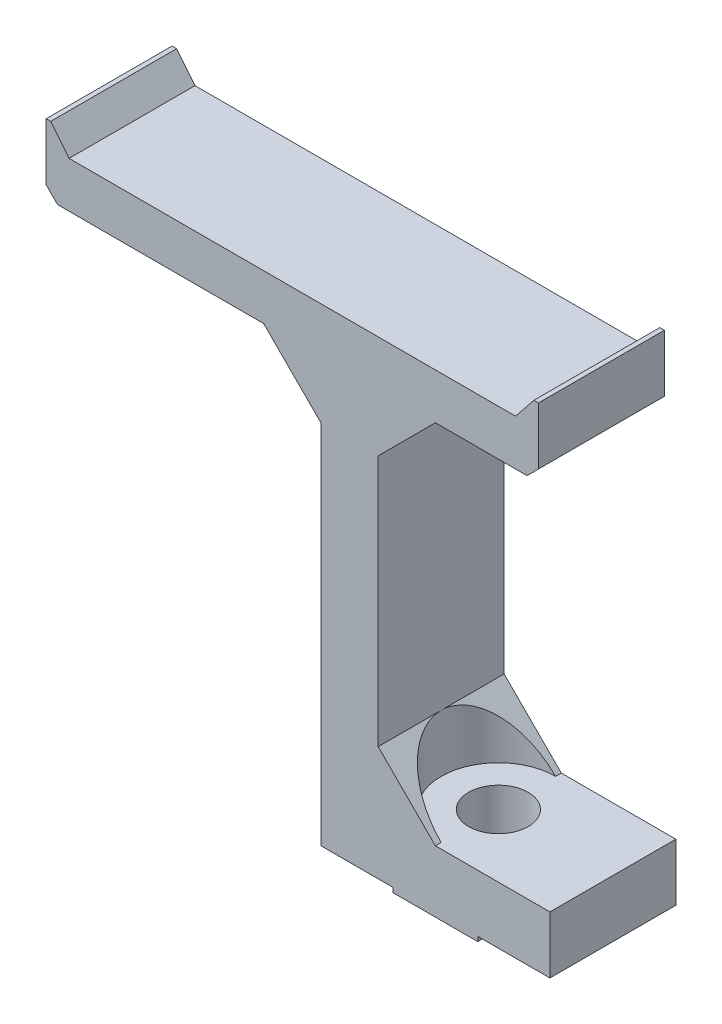
ISO-10303-21;
HEADER;
FILE_DESCRIPTION(('STEP AP214'),'2;1');
FILE_NAME('part.step','',(''),(''),'','','');
FILE_SCHEMA(('AUTOMOTIVE_DESIGN { 1 0 10303 214 1 1 1 1 }'));
ENDSEC;
DATA;
#1=APPLICATION_CONTEXT('core data for automotive mechanical design processes');
#2=APPLICATION_PROTOCOL_DEFINITION('international standard','automotive_design',2000,#1);
#3=PRODUCT_CONTEXT('',#1,'mechanical');
#4=PRODUCT('Part','Part','',(#3));
#5=PRODUCT_RELATED_PRODUCT_CATEGORY('part','',(#4));
#6=PRODUCT_DEFINITION_FORMATION('','',#4);
#7=PRODUCT_DEFINITION_CONTEXT('part definition',#1,'design');
#8=PRODUCT_DEFINITION('design','',#6,#7);
#9=PRODUCT_DEFINITION_SHAPE('','',#8);
#10=(LENGTH_UNIT() NAMED_UNIT(*) SI_UNIT(.MILLI.,.METRE.));
#11=(NAMED_UNIT(*) PLANE_ANGLE_UNIT() SI_UNIT($,.RADIAN.));
#12=(NAMED_UNIT(*) SI_UNIT($,.STERADIAN.) SOLID_ANGLE_UNIT());
#13=UNCERTAINTY_MEASURE_WITH_UNIT(LENGTH_MEASURE(1.E-05),#10,'distance_accuracy_value','');
#14=(GEOMETRIC_REPRESENTATION_CONTEXT(3) GLOBAL_UNCERTAINTY_ASSIGNED_CONTEXT((#13)) GLOBAL_UNIT_ASSIGNED_CONTEXT((#10,
#11,#12)) REPRESENTATION_CONTEXT('',''));
#15=CARTESIAN_POINT('',(0.,0.,0.));
#16=DIRECTION('',(0.,0.,1.));
#17=DIRECTION('',(1.,0.,0.));
#18=AXIS2_PLACEMENT_3D('',#15,#16,#17);
#19=CARTESIAN_POINT('',(-5.,10.4000000000087,11.));
#20=DIRECTION('',(0.707106781186548,0.707106781186547,0.));
#21=DIRECTION('',(0.,0.,1.));
#22=AXIS2_PLACEMENT_3D('',#19,#20,#21);
#23=PLANE('',#22);
#24=CARTESIAN_POINT('',(0.,5.40000000000869,5.5));
#25=DIRECTION('',(0.707106781186548,0.707106781186547,0.));
#26=DIRECTION('',(0.707106781186547,-0.707106781186548,0.));
#27=AXIS2_PLACEMENT_3D('',#24,#25,#26);
#28=ELLIPSE('',#27,7.07106781186548,5.);
#29=CARTESIAN_POINT('',(0.,5.40000000000873,0.499999999999997));
#30=VERTEX_POINT('',#29);
#31=CARTESIAN_POINT('',(-5.,10.4000000000087,5.5));
#32=VERTEX_POINT('',#31);
#33=EDGE_CURVE('E11',#30,#32,#28,.T.);
#34=ORIENTED_EDGE('',*,*,#33,.F.);
#35=DIRECTION('',(0.,0.,1.));
#36=VECTOR('',#35,1.);
#37=CARTESIAN_POINT('',(0.,5.40000000000873,11.));
#38=LINE('',#37,#36);
#39=CARTESIAN_POINT('',(0.,5.40000000000873,0.));
#40=VERTEX_POINT('',#39);
#41=EDGE_CURVE('E217',#40,#30,#38,.T.);
#42=ORIENTED_EDGE('',*,*,#41,.F.);
#43=DIRECTION('',(-0.707106781186547,0.707106781186548,0.));
#44=VECTOR('',#43,1.);
#45=CARTESIAN_POINT('',(2.70000000000435,2.70000000000434,0.));
#46=LINE('',#45,#44);
#47=CARTESIAN_POINT('',(-5.,10.4000000000087,0.));
#48=VERTEX_POINT('',#47);
#49=EDGE_CURVE('E238',#48,#40,#46,.F.);
#50=ORIENTED_EDGE('',*,*,#49,.F.);
#51=DIRECTION('',(0.,0.,-1.));
#52=VECTOR('',#51,1.);
#53=CARTESIAN_POINT('',(-5.,10.4000000000087,0.));
#54=LINE('',#53,#52);
#55=EDGE_CURVE('E339',#32,#48,#54,.T.);
#56=ORIENTED_EDGE('',*,*,#55,.F.);
#57=EDGE_LOOP('',(#34,#42,#50,#56));
#58=FACE_BOUND('',#57,.T.);
#59=ADVANCED_FACE('F36',(#58),#23,.T.);
#60=CARTESIAN_POINT('',(0.,5.40000000000873,10.5));
#61=VERTEX_POINT('',#60);
#62=EDGE_CURVE('E40',#32,#61,#28,.T.);
#63=ORIENTED_EDGE('',*,*,#62,.F.);
#64=CARTESIAN_POINT('',(-5.,10.4000000000087,11.));
#65=VERTEX_POINT('',#64);
#66=EDGE_CURVE('E226',#65,#32,#54,.T.);
#67=ORIENTED_EDGE('',*,*,#66,.F.);
#68=DIRECTION('',(0.707106781186547,-0.707106781186548,0.));
#69=VECTOR('',#68,1.);
#70=CARTESIAN_POINT('',(-5.,10.4000000000087,11.));
#71=LINE('',#70,#69);
#72=CARTESIAN_POINT('',(0.,5.40000000000873,11.));
#73=VERTEX_POINT('',#72);
#74=EDGE_CURVE('E222',#73,#65,#71,.F.);
#75=ORIENTED_EDGE('',*,*,#74,.F.);
#76=EDGE_CURVE('E213',#61,#73,#38,.T.);
#77=ORIENTED_EDGE('',*,*,#76,.F.);
#78=EDGE_LOOP('',(#63,#67,#75,#77));
#79=FACE_BOUND('',#78,.T.);
#80=ADVANCED_FACE('F221',(#79),#23,.T.);
#81=CARTESIAN_POINT('',(-10.,0.4,11.));
#82=DIRECTION('',(1.,0.,0.));
#83=DIRECTION('',(0.,1.,0.));
#84=AXIS2_PLACEMENT_3D('',#81,#82,#83);
#85=PLANE('',#84);
#86=DIRECTION('',(0.,-1.,0.));
#87=VECTOR('',#86,1.);
#88=CARTESIAN_POINT('',(-10.,0.4,11.));
#89=LINE('',#88,#87);
#90=CARTESIAN_POINT('',(-10.,32.4,11.));
#91=VERTEX_POINT('',#90);
#92=CARTESIAN_POINT('',(-10.,0.4,11.));
#93=VERTEX_POINT('',#92);
#94=EDGE_CURVE('E291',#91,#93,#89,.T.);
#95=ORIENTED_EDGE('',*,*,#94,.F.);
#96=DIRECTION('',(0.,0.,-1.));
#97=VECTOR('',#96,1.);
#98=CARTESIAN_POINT('',(-10.,32.4,0.));
#99=LINE('',#98,#97);
#100=CARTESIAN_POINT('',(-10.,32.4,0.));
#101=VERTEX_POINT('',#100);
#102=EDGE_CURVE('E331',#91,#101,#99,.T.);
#103=ORIENTED_EDGE('',*,*,#102,.T.);
#104=DIRECTION('',(0.,-1.,0.));
#105=VECTOR('',#104,1.);
#106=CARTESIAN_POINT('',(-10.,0.4,0.));
#107=LINE('',#106,#105);
#108=CARTESIAN_POINT('',(-10.,0.4,0.));
#109=VERTEX_POINT('',#108);
#110=EDGE_CURVE('E365',#101,#109,#107,.T.);
#111=ORIENTED_EDGE('',*,*,#110,.T.);
#112=DIRECTION('',(0.,0.,-1.));
#113=VECTOR('',#112,1.);
#114=CARTESIAN_POINT('',(-10.,0.4,11.));
#115=LINE('',#114,#113);
#116=EDGE_CURVE('E328',#93,#109,#115,.T.);
#117=ORIENTED_EDGE('',*,*,#116,.F.);
#118=EDGE_LOOP('',(#95,#103,#111,#117));
#119=FACE_BOUND('',#118,.T.);
#120=ADVANCED_FACE('F433',(#119),#85,.F.);
#121=CARTESIAN_POINT('',(-10.,0.4,11.));
#122=DIRECTION('',(0.,1.,0.));
#123=DIRECTION('',(0.,0.,1.));
#124=AXIS2_PLACEMENT_3D('',#121,#122,#123);
#125=PLANE('',#124);
#126=DIRECTION('',(1.,0.,0.));
#127=VECTOR('',#126,1.);
#128=CARTESIAN_POINT('',(-10.,0.4,0.));
#129=LINE('',#128,#127);
#130=CARTESIAN_POINT('',(-3.7,0.4,0.));
#131=VERTEX_POINT('',#130);
#132=EDGE_CURVE('E363',#109,#131,#129,.T.);
#133=ORIENTED_EDGE('',*,*,#132,.T.);
#134=DIRECTION('',(0.,0.,-1.));
#135=VECTOR('',#134,1.);
#136=CARTESIAN_POINT('',(-3.7,0.4,11.));
#137=LINE('',#136,#135);
#138=CARTESIAN_POINT('',(-3.7,0.4,11.));
#139=VERTEX_POINT('',#138);
#140=EDGE_CURVE('E325',#139,#131,#137,.T.);
#141=ORIENTED_EDGE('',*,*,#140,.F.);
#142=DIRECTION('',(1.,0.,0.));
#143=VECTOR('',#142,1.);
#144=CARTESIAN_POINT('',(-10.,0.4,11.));
#145=LINE('',#144,#143);
#146=EDGE_CURVE('E400',#93,#139,#145,.T.);
#147=ORIENTED_EDGE('',*,*,#146,.F.);
#148=ORIENTED_EDGE('',*,*,#116,.T.);
#149=EDGE_LOOP('',(#133,#141,#147,#148));
#150=FACE_BOUND('',#149,.T.);
#151=ADVANCED_FACE('F465',(#150),#125,.F.);
#152=CARTESIAN_POINT('',(-3.7,0.4,11.));
#153=DIRECTION('',(1.,0.,0.));
#154=DIRECTION('',(0.,1.,0.));
#155=AXIS2_PLACEMENT_3D('',#152,#153,#154);
#156=PLANE('',#155);
#157=DIRECTION('',(0.,-1.,0.));
#158=VECTOR('',#157,1.);
#159=CARTESIAN_POINT('',(-3.7,0.4,0.));
#160=LINE('',#159,#158);
#161=CARTESIAN_POINT('',(-3.7,0.,0.));
#162=VERTEX_POINT('',#161);
#163=EDGE_CURVE('E361',#131,#162,#160,.T.);
#164=ORIENTED_EDGE('',*,*,#163,.T.);
#165=DIRECTION('',(0.,0.,-1.));
#166=VECTOR('',#165,1.);
#167=CARTESIAN_POINT('',(-3.7,0.,11.));
#168=LINE('',#167,#166);
#169=CARTESIAN_POINT('',(-3.7,0.,11.));
#170=VERTEX_POINT('',#169);
#171=EDGE_CURVE('E322',#170,#162,#168,.T.);
#172=ORIENTED_EDGE('',*,*,#171,.F.);
#173=DIRECTION('',(0.,-1.,0.));
#174=VECTOR('',#173,1.);
#175=CARTESIAN_POINT('',(-3.7,0.4,11.));
#176=LINE('',#175,#174);
#177=EDGE_CURVE('E398',#139,#170,#176,.T.);
#178=ORIENTED_EDGE('',*,*,#177,.F.);
#179=ORIENTED_EDGE('',*,*,#140,.T.);
#180=EDGE_LOOP('',(#164,#172,#178,#179));
#181=FACE_BOUND('',#180,.T.);
#182=ADVANCED_FACE('F472',(#181),#156,.F.);
#183=CARTESIAN_POINT('',(-3.7,0.,11.));
#184=DIRECTION('',(0.,1.,0.));
#185=DIRECTION('',(0.,0.,1.));
#186=AXIS2_PLACEMENT_3D('',#183,#184,#185);
#187=PLANE('',#186);
#188=CARTESIAN_POINT('',(0.,0.,5.5));
#189=DIRECTION('',(0.,1.,0.));
#190=DIRECTION('',(-1.,0.,0.));
#191=AXIS2_PLACEMENT_3D('',#188,#189,#190);
#192=CIRCLE('',#191,2.6);
#193=CARTESIAN_POINT('',(-2.6,0.,5.5));
#194=VERTEX_POINT('',#193);
#195=EDGE_CURVE('E367',#194,#194,#192,.T.);
#196=ORIENTED_EDGE('',*,*,#195,.T.);
#197=EDGE_LOOP('',(#196));
#198=FACE_BOUND('',#197,.T.);
#199=DIRECTION('',(1.,0.,0.));
#200=VECTOR('',#199,1.);
#201=CARTESIAN_POINT('',(-3.7,0.,0.));
#202=LINE('',#201,#200);
#203=CARTESIAN_POINT('',(3.7,0.,0.));
#204=VERTEX_POINT('',#203);
#205=EDGE_CURVE('E359',#162,#204,#202,.T.);
#206=ORIENTED_EDGE('',*,*,#205,.T.);
#207=DIRECTION('',(0.,0.,-1.));
#208=VECTOR('',#207,1.);
#209=CARTESIAN_POINT('',(3.7,0.,11.));
#210=LINE('',#209,#208);
#211=CARTESIAN_POINT('',(3.7,0.,11.));
#212=VERTEX_POINT('',#211);
#213=EDGE_CURVE('E319',#212,#204,#210,.T.);
#214=ORIENTED_EDGE('',*,*,#213,.F.);
#215=DIRECTION('',(1.,0.,0.));
#216=VECTOR('',#215,1.);
#217=CARTESIAN_POINT('',(-3.7,0.,11.));
#218=LINE('',#217,#216);
#219=EDGE_CURVE('E396',#170,#212,#218,.T.);
#220=ORIENTED_EDGE('',*,*,#219,.F.);
#221=ORIENTED_EDGE('',*,*,#171,.T.);
#222=EDGE_LOOP('',(#206,#214,#220,#221));
#223=FACE_BOUND('',#222,.T.);
#224=ADVANCED_FACE('F408',(#198,#223),#187,.F.);
#225=CARTESIAN_POINT('',(3.7,0.,11.));
#226=DIRECTION('',(-1.,0.,0.));
#227=DIRECTION('',(0.,0.,1.));
#228=AXIS2_PLACEMENT_3D('',#225,#226,#227);
#229=PLANE('',#228);
#230=DIRECTION('',(0.,1.,0.));
#231=VECTOR('',#230,1.);
#232=CARTESIAN_POINT('',(3.7,0.,0.));
#233=LINE('',#232,#231);
#234=CARTESIAN_POINT('',(3.7,0.4,0.));
#235=VERTEX_POINT('',#234);
#236=EDGE_CURVE('E357',#204,#235,#233,.T.);
#237=ORIENTED_EDGE('',*,*,#236,.T.);
#238=DIRECTION('',(0.,0.,-1.));
#239=VECTOR('',#238,1.);
#240=CARTESIAN_POINT('',(3.7,0.4,11.));
#241=LINE('',#240,#239);
#242=CARTESIAN_POINT('',(3.7,0.4,11.));
#243=VERTEX_POINT('',#242);
#244=EDGE_CURVE('E316',#243,#235,#241,.T.);
#245=ORIENTED_EDGE('',*,*,#244,.F.);
#246=DIRECTION('',(0.,1.,0.));
#247=VECTOR('',#246,1.);
#248=CARTESIAN_POINT('',(3.7,0.,11.));
#249=LINE('',#248,#247);
#250=EDGE_CURVE('E394',#212,#243,#249,.T.);
#251=ORIENTED_EDGE('',*,*,#250,.F.);
#252=ORIENTED_EDGE('',*,*,#213,.T.);
#253=EDGE_LOOP('',(#237,#245,#251,#252));
#254=FACE_BOUND('',#253,.T.);
#255=ADVANCED_FACE('F479',(#254),#229,.F.);
#256=CARTESIAN_POINT('',(3.7,0.4,11.));
#257=DIRECTION('',(0.,1.,0.));
#258=DIRECTION('',(-1.,0.,0.));
#259=AXIS2_PLACEMENT_3D('',#256,#257,#258);
#260=PLANE('',#259);
#261=DIRECTION('',(1.,0.,0.));
#262=VECTOR('',#261,1.);
#263=CARTESIAN_POINT('',(3.7,0.4,0.));
#264=LINE('',#263,#262);
#265=CARTESIAN_POINT('',(10.,0.400000000000017,0.));
#266=VERTEX_POINT('',#265);
#267=EDGE_CURVE('E355',#235,#266,#264,.T.);
#268=ORIENTED_EDGE('',*,*,#267,.T.);
#269=DIRECTION('',(0.,0.,-1.));
#270=VECTOR('',#269,1.);
#271=CARTESIAN_POINT('',(10.,0.400000000000017,11.));
#272=LINE('',#271,#270);
#273=CARTESIAN_POINT('',(10.,0.400000000000017,11.));
#274=VERTEX_POINT('',#273);
#275=EDGE_CURVE('E313',#274,#266,#272,.T.);
#276=ORIENTED_EDGE('',*,*,#275,.F.);
#277=DIRECTION('',(1.,0.,0.));
#278=VECTOR('',#277,1.);
#279=CARTESIAN_POINT('',(3.7,0.4,11.));
#280=LINE('',#279,#278);
#281=EDGE_CURVE('E392',#243,#274,#280,.T.);
#282=ORIENTED_EDGE('',*,*,#281,.F.);
#283=ORIENTED_EDGE('',*,*,#244,.T.);
#284=EDGE_LOOP('',(#268,#276,#282,#283));
#285=FACE_BOUND('',#284,.T.);
#286=ADVANCED_FACE('F425',(#285),#260,.F.);
#287=CARTESIAN_POINT('',(10.,0.400000000000017,11.));
#288=DIRECTION('',(-1.,0.,0.));
#289=DIRECTION('',(0.,-1.,0.));
#290=AXIS2_PLACEMENT_3D('',#287,#288,#289);
#291=PLANE('',#290);
#292=DIRECTION('',(0.,1.,0.));
#293=VECTOR('',#292,1.);
#294=CARTESIAN_POINT('',(10.,0.400000000000017,0.));
#295=LINE('',#294,#293);
#296=CARTESIAN_POINT('',(10.,5.40000000000873,0.));
#297=VERTEX_POINT('',#296);
#298=EDGE_CURVE('E351',#266,#297,#295,.T.);
#299=ORIENTED_EDGE('',*,*,#298,.T.);
#300=DIRECTION('',(0.,0.,-1.));
#301=VECTOR('',#300,1.);
#302=CARTESIAN_POINT('',(10.,5.40000000000873,11.));
#303=LINE('',#302,#301);
#304=CARTESIAN_POINT('',(10.,5.40000000000873,11.));
#305=VERTEX_POINT('',#304);
#306=EDGE_CURVE('E310',#305,#297,#303,.T.);
#307=ORIENTED_EDGE('',*,*,#306,.F.);
#308=DIRECTION('',(0.,1.,0.));
#309=VECTOR('',#308,1.);
#310=CARTESIAN_POINT('',(10.,0.400000000000017,11.));
#311=LINE('',#310,#309);
#312=EDGE_CURVE('E390',#274,#305,#311,.T.);
#313=ORIENTED_EDGE('',*,*,#312,.F.);
#314=ORIENTED_EDGE('',*,*,#275,.T.);
#315=EDGE_LOOP('',(#299,#307,#313,#314));
#316=FACE_BOUND('',#315,.T.);
#317=ADVANCED_FACE('F417',(#316),#291,.F.);
#318=CARTESIAN_POINT('',(10.,5.40000000000873,11.));
#319=DIRECTION('',(0.,-1.,0.));
#320=DIRECTION('',(1.,0.,0.));
#321=AXIS2_PLACEMENT_3D('',#318,#319,#320);
#322=PLANE('',#321);
#323=ORIENTED_EDGE('',*,*,#41,.T.);
#324=CARTESIAN_POINT('',(0.,5.40000000000873,5.5));
#325=DIRECTION('',(0.,1.,0.));
#326=DIRECTION('',(-1.,0.,0.));
#327=AXIS2_PLACEMENT_3D('',#324,#325,#326);
#328=CIRCLE('',#327,5.);
#329=EDGE_CURVE('E202',#30,#61,#328,.T.);
#330=ORIENTED_EDGE('',*,*,#329,.T.);
#331=ORIENTED_EDGE('',*,*,#76,.T.);
#332=DIRECTION('',(-1.,0.,0.));
#333=VECTOR('',#332,1.);
#334=CARTESIAN_POINT('',(10.,5.40000000000873,11.));
#335=LINE('',#334,#333);
#336=EDGE_CURVE('E388',#305,#73,#335,.T.);
#337=ORIENTED_EDGE('',*,*,#336,.F.);
#338=ORIENTED_EDGE('',*,*,#306,.T.);
#339=DIRECTION('',(-1.,0.,0.));
#340=VECTOR('',#339,1.);
#341=CARTESIAN_POINT('',(10.,5.40000000000873,0.));
#342=LINE('',#341,#340);
#343=EDGE_CURVE('E350',#297,#40,#342,.T.);
#344=ORIENTED_EDGE('',*,*,#343,.T.);
#345=EDGE_LOOP('',(#323,#330,#331,#337,#338,#344));
#346=FACE_BOUND('',#345,.T.);
#347=CARTESIAN_POINT('',(0.,5.40000000000873,5.5));
#348=DIRECTION('',(0.,1.,0.));
#349=DIRECTION('',(-1.,0.,0.));
#350=AXIS2_PLACEMENT_3D('',#347,#348,#349);
#351=CIRCLE('',#350,2.6);
#352=CARTESIAN_POINT('',(-2.6,5.40000000000873,5.5));
#353=VERTEX_POINT('',#352);
#354=EDGE_CURVE('E218',#353,#353,#351,.T.);
#355=ORIENTED_EDGE('',*,*,#354,.F.);
#356=EDGE_LOOP('',(#355));
#357=FACE_BOUND('',#356,.T.);
#358=ADVANCED_FACE('F210',(#346,#357),#322,.F.);
#359=CARTESIAN_POINT('',(-5.00000000000001,5.40000000000873,11.));
#360=DIRECTION('',(-1.,0.,0.));
#361=DIRECTION('',(0.,-1.,0.));
#362=AXIS2_PLACEMENT_3D('',#359,#360,#361);
#363=PLANE('',#362);
#364=DIRECTION('',(0.,1.,0.));
#365=VECTOR('',#364,1.);
#366=CARTESIAN_POINT('',(-5.00000000000001,5.40000000000873,0.));
#367=LINE('',#366,#365);
#368=CARTESIAN_POINT('',(-5.,32.4,0.));
#369=VERTEX_POINT('',#368);
#370=EDGE_CURVE('E275',#48,#369,#367,.T.);
#371=ORIENTED_EDGE('',*,*,#370,.T.);
#372=DIRECTION('',(0.,0.,1.));
#373=VECTOR('',#372,1.);
#374=CARTESIAN_POINT('',(-5.,32.4,11.));
#375=LINE('',#374,#373);
#376=CARTESIAN_POINT('',(-5.,32.4,11.));
#377=VERTEX_POINT('',#376);
#378=EDGE_CURVE('E223',#369,#377,#375,.T.);
#379=ORIENTED_EDGE('',*,*,#378,.T.);
#380=DIRECTION('',(0.,1.,0.));
#381=VECTOR('',#380,1.);
#382=CARTESIAN_POINT('',(-5.00000000000001,5.40000000000873,11.));
#383=LINE('',#382,#381);
#384=EDGE_CURVE('E385',#65,#377,#383,.T.);
#385=ORIENTED_EDGE('',*,*,#384,.F.);
#386=ORIENTED_EDGE('',*,*,#66,.T.);
#387=ORIENTED_EDGE('',*,*,#55,.T.);
#388=EDGE_LOOP('',(#371,#379,#385,#386,#387));
#389=FACE_BOUND('',#388,.T.);
#390=ADVANCED_FACE('F345',(#389),#363,.F.);
#391=CARTESIAN_POINT('',(8.99999999999998,37.4,11.));
#392=DIRECTION('',(0.,1.,0.));
#393=DIRECTION('',(-1.,0.,0.));
#394=AXIS2_PLACEMENT_3D('',#391,#392,#393);
#395=PLANE('',#394);
#396=DIRECTION('',(1.,0.,0.));
#397=VECTOR('',#396,1.);
#398=CARTESIAN_POINT('',(8.99999999999998,37.4,0.));
#399=LINE('',#398,#397);
#400=CARTESIAN_POINT('',(0.,37.4,0.));
#401=VERTEX_POINT('',#400);
#402=CARTESIAN_POINT('',(7.99999999999998,37.4,0.));
#403=VERTEX_POINT('',#402);
#404=EDGE_CURVE('E271',#401,#403,#399,.T.);
#405=ORIENTED_EDGE('',*,*,#404,.T.);
#406=DIRECTION('',(0.,0.,1.));
#407=VECTOR('',#406,1.);
#408=CARTESIAN_POINT('',(7.99999999999998,37.4,11.));
#409=LINE('',#408,#407);
#410=CARTESIAN_POINT('',(7.99999999999998,37.4,11.));
#411=VERTEX_POINT('',#410);
#412=EDGE_CURVE('E59',#403,#411,#409,.T.);
#413=ORIENTED_EDGE('',*,*,#412,.T.);
#414=DIRECTION('',(1.,0.,0.));
#415=VECTOR('',#414,1.);
#416=CARTESIAN_POINT('',(8.99999999999998,37.4,11.));
#417=LINE('',#416,#415);
#418=CARTESIAN_POINT('',(0.,37.4,11.));
#419=VERTEX_POINT('',#418);
#420=EDGE_CURVE('E383',#419,#411,#417,.T.);
#421=ORIENTED_EDGE('',*,*,#420,.F.);
#422=DIRECTION('',(0.,0.,-1.));
#423=VECTOR('',#422,1.);
#424=CARTESIAN_POINT('',(0.,37.4,0.));
#425=LINE('',#424,#423);
#426=EDGE_CURVE('E337',#419,#401,#425,.T.);
#427=ORIENTED_EDGE('',*,*,#426,.T.);
#428=EDGE_LOOP('',(#405,#413,#421,#427));
#429=FACE_BOUND('',#428,.T.);
#430=ADVANCED_FACE('F423',(#429),#395,.F.);
#431=CARTESIAN_POINT('',(8.99999999999998,37.4,11.));
#432=DIRECTION('',(-1.,0.,0.));
#433=DIRECTION('',(0.,-1.,0.));
#434=AXIS2_PLACEMENT_3D('',#431,#432,#433);
#435=PLANE('',#434);
#436=DIRECTION('',(0.,1.,0.));
#437=VECTOR('',#436,1.);
#438=CARTESIAN_POINT('',(8.99999999999998,37.4,11.));
#439=LINE('',#438,#437);
#440=CARTESIAN_POINT('',(8.99999999999998,38.4,11.));
#441=VERTEX_POINT('',#440);
#442=CARTESIAN_POINT('',(8.99999999999999,43.4,11.));
#443=VERTEX_POINT('',#442);
#444=EDGE_CURVE('E262',#441,#443,#439,.T.);
#445=ORIENTED_EDGE('',*,*,#444,.F.);
#446=DIRECTION('',(0.,0.,-1.));
#447=VECTOR('',#446,1.);
#448=CARTESIAN_POINT('',(8.99999999999998,38.4,11.));
#449=LINE('',#448,#447);
#450=CARTESIAN_POINT('',(8.99999999999998,38.4,0.));
#451=VERTEX_POINT('',#450);
#452=EDGE_CURVE('E253',#441,#451,#449,.T.);
#453=ORIENTED_EDGE('',*,*,#452,.T.);
#454=DIRECTION('',(0.,1.,0.));
#455=VECTOR('',#454,1.);
#456=CARTESIAN_POINT('',(8.99999999999998,37.4,0.));
#457=LINE('',#456,#455);
#458=CARTESIAN_POINT('',(8.99999999999999,43.4,0.));
#459=VERTEX_POINT('',#458);
#460=EDGE_CURVE('E260',#451,#459,#457,.T.);
#461=ORIENTED_EDGE('',*,*,#460,.T.);
#462=DIRECTION('',(0.,0.,-1.));
#463=VECTOR('',#462,1.);
#464=CARTESIAN_POINT('',(8.99999999999999,43.4,11.));
#465=LINE('',#464,#463);
#466=EDGE_CURVE('E308',#443,#459,#465,.T.);
#467=ORIENTED_EDGE('',*,*,#466,.F.);
#468=EDGE_LOOP('',(#445,#453,#461,#467));
#469=FACE_BOUND('',#468,.T.);
#470=ADVANCED_FACE('F258',(#469),#435,.F.);
#471=CARTESIAN_POINT('',(8.99999999999999,43.4,11.));
#472=DIRECTION('',(0.,-1.,0.));
#473=DIRECTION('',(1.,0.,0.));
#474=AXIS2_PLACEMENT_3D('',#471,#472,#473);
#475=PLANE('',#474);
#476=DIRECTION('',(-1.,0.,0.));
#477=VECTOR('',#476,1.);
#478=CARTESIAN_POINT('',(8.99999999999999,43.4,0.));
#479=LINE('',#478,#477);
#480=CARTESIAN_POINT('',(8.59999999999999,43.4,0.));
#481=VERTEX_POINT('',#480);
#482=EDGE_CURVE('E270',#459,#481,#479,.T.);
#483=ORIENTED_EDGE('',*,*,#482,.T.);
#484=DIRECTION('',(0.,0.,-1.));
#485=VECTOR('',#484,1.);
#486=CARTESIAN_POINT('',(8.59999999999999,43.4,11.));
#487=LINE('',#486,#485);
#488=CARTESIAN_POINT('',(8.59999999999999,43.4,11.));
#489=VERTEX_POINT('',#488);
#490=EDGE_CURVE('E305',#489,#481,#487,.T.);
#491=ORIENTED_EDGE('',*,*,#490,.F.);
#492=DIRECTION('',(-1.,0.,0.));
#493=VECTOR('',#492,1.);
#494=CARTESIAN_POINT('',(8.99999999999999,43.4,11.));
#495=LINE('',#494,#493);
#496=EDGE_CURVE('E380',#443,#489,#495,.T.);
#497=ORIENTED_EDGE('',*,*,#496,.F.);
#498=ORIENTED_EDGE('',*,*,#466,.T.);
#499=EDGE_LOOP('',(#483,#491,#497,#498));
#500=FACE_BOUND('',#499,.T.);
#501=ADVANCED_FACE('F494',(#500),#475,.F.);
#502=CARTESIAN_POINT('',(8.59999999999999,43.4,11.));
#503=DIRECTION('',(0.780868809443031,-0.624695047554424,0.));
#504=DIRECTION('',(0.624695047554424,0.78086880944303,0.));
#505=AXIS2_PLACEMENT_3D('',#502,#503,#504);
#506=PLANE('',#505);
#507=DIRECTION('',(-0.624695047554424,-0.78086880944303,0.));
#508=VECTOR('',#507,1.);
#509=CARTESIAN_POINT('',(8.59999999999999,43.4,0.));
#510=LINE('',#509,#508);
#511=CARTESIAN_POINT('',(6.99999999999999,41.4,0.));
#512=VERTEX_POINT('',#511);
#513=EDGE_CURVE('E273',#481,#512,#510,.T.);
#514=ORIENTED_EDGE('',*,*,#513,.T.);
#515=DIRECTION('',(0.,0.,-1.));
#516=VECTOR('',#515,1.);
#517=CARTESIAN_POINT('',(6.99999999999999,41.4,11.));
#518=LINE('',#517,#516);
#519=CARTESIAN_POINT('',(6.99999999999999,41.4,11.));
#520=VERTEX_POINT('',#519);
#521=EDGE_CURVE('E302',#520,#512,#518,.T.);
#522=ORIENTED_EDGE('',*,*,#521,.F.);
#523=DIRECTION('',(-0.624695047554424,-0.78086880944303,0.));
#524=VECTOR('',#523,1.);
#525=CARTESIAN_POINT('',(8.59999999999999,43.4,11.));
#526=LINE('',#525,#524);
#527=EDGE_CURVE('E378',#489,#520,#526,.T.);
#528=ORIENTED_EDGE('',*,*,#527,.F.);
#529=ORIENTED_EDGE('',*,*,#490,.T.);
#530=EDGE_LOOP('',(#514,#522,#528,#529));
#531=FACE_BOUND('',#530,.T.);
#532=ADVANCED_FACE('F499',(#531),#506,.F.);
#533=CARTESIAN_POINT('',(6.99999999999999,41.4,11.));
#534=DIRECTION('',(0.,-1.,0.));
#535=DIRECTION('',(0.,0.,-1.));
#536=AXIS2_PLACEMENT_3D('',#533,#534,#535);
#537=PLANE('',#536);
#538=DIRECTION('',(-1.,0.,0.));
#539=VECTOR('',#538,1.);
#540=CARTESIAN_POINT('',(6.99999999999999,41.4,0.));
#541=LINE('',#540,#539);
#542=CARTESIAN_POINT('',(-32.,41.4,0.));
#543=VERTEX_POINT('',#542);
#544=EDGE_CURVE('E280',#512,#543,#541,.T.);
#545=ORIENTED_EDGE('',*,*,#544,.T.);
#546=DIRECTION('',(0.,0.,-1.));
#547=VECTOR('',#546,1.);
#548=CARTESIAN_POINT('',(-32.,41.4,11.));
#549=LINE('',#548,#547);
#550=CARTESIAN_POINT('',(-32.,41.4,11.));
#551=VERTEX_POINT('',#550);
#552=EDGE_CURVE('E299',#551,#543,#549,.T.);
#553=ORIENTED_EDGE('',*,*,#552,.F.);
#554=DIRECTION('',(-1.,0.,0.));
#555=VECTOR('',#554,1.);
#556=CARTESIAN_POINT('',(6.99999999999999,41.4,11.));
#557=LINE('',#556,#555);
#558=EDGE_CURVE('E376',#520,#551,#557,.T.);
#559=ORIENTED_EDGE('',*,*,#558,.F.);
#560=ORIENTED_EDGE('',*,*,#521,.T.);
#561=EDGE_LOOP('',(#545,#553,#559,#560));
#562=FACE_BOUND('',#561,.T.);
#563=ADVANCED_FACE('F503',(#562),#537,.F.);
#564=CARTESIAN_POINT('',(-33.6,43.4,11.));
#565=DIRECTION('',(-0.780868809443034,-0.62469504755442,0.));
#566=DIRECTION('',(0.62469504755442,-0.780868809443034,0.));
#567=AXIS2_PLACEMENT_3D('',#564,#565,#566);
#568=PLANE('',#567);
#569=DIRECTION('',(-0.62469504755442,0.780868809443034,0.));
#570=VECTOR('',#569,1.);
#571=CARTESIAN_POINT('',(-33.6,43.4,0.));
#572=LINE('',#571,#570);
#573=CARTESIAN_POINT('',(-33.6,43.4,0.));
#574=VERTEX_POINT('',#573);
#575=EDGE_CURVE('E282',#543,#574,#572,.T.);
#576=ORIENTED_EDGE('',*,*,#575,.T.);
#577=DIRECTION('',(0.,0.,-1.));
#578=VECTOR('',#577,1.);
#579=CARTESIAN_POINT('',(-33.6,43.4,11.));
#580=LINE('',#579,#578);
#581=CARTESIAN_POINT('',(-33.6,43.4,11.));
#582=VERTEX_POINT('',#581);
#583=EDGE_CURVE('E295',#582,#574,#580,.T.);
#584=ORIENTED_EDGE('',*,*,#583,.F.);
#585=DIRECTION('',(-0.62469504755442,0.780868809443034,0.));
#586=VECTOR('',#585,1.);
#587=CARTESIAN_POINT('',(-33.6,43.4,11.));
#588=LINE('',#587,#586);
#589=EDGE_CURVE('E374',#551,#582,#588,.T.);
#590=ORIENTED_EDGE('',*,*,#589,.F.);
#591=ORIENTED_EDGE('',*,*,#552,.T.);
#592=EDGE_LOOP('',(#576,#584,#590,#591));
#593=FACE_BOUND('',#592,.T.);
#594=ADVANCED_FACE('F507',(#593),#568,.F.);
#595=CARTESIAN_POINT('',(-34.,43.4,11.));
#596=DIRECTION('',(0.,-1.,0.));
#597=DIRECTION('',(0.,0.,-1.));
#598=AXIS2_PLACEMENT_3D('',#595,#596,#597);
#599=PLANE('',#598);
#600=DIRECTION('',(-1.,0.,0.));
#601=VECTOR('',#600,1.);
#602=CARTESIAN_POINT('',(-34.,43.4,0.));
#603=LINE('',#602,#601);
#604=CARTESIAN_POINT('',(-34.,43.4,0.));
#605=VERTEX_POINT('',#604);
#606=EDGE_CURVE('E284',#574,#605,#603,.T.);
#607=ORIENTED_EDGE('',*,*,#606,.T.);
#608=DIRECTION('',(0.,0.,-1.));
#609=VECTOR('',#608,1.);
#610=CARTESIAN_POINT('',(-34.,43.4,11.));
#611=LINE('',#610,#609);
#612=CARTESIAN_POINT('',(-34.,43.4,11.));
#613=VERTEX_POINT('',#612);
#614=EDGE_CURVE('E292',#613,#605,#611,.T.);
#615=ORIENTED_EDGE('',*,*,#614,.F.);
#616=DIRECTION('',(-1.,0.,0.));
#617=VECTOR('',#616,1.);
#618=CARTESIAN_POINT('',(-34.,43.4,11.));
#619=LINE('',#618,#617);
#620=EDGE_CURVE('E372',#582,#613,#619,.T.);
#621=ORIENTED_EDGE('',*,*,#620,.F.);
#622=ORIENTED_EDGE('',*,*,#583,.T.);
#623=EDGE_LOOP('',(#607,#615,#621,#622));
#624=FACE_BOUND('',#623,.T.);
#625=ADVANCED_FACE('F511',(#624),#599,.F.);
#626=CARTESIAN_POINT('',(-34.,37.4,11.));
#627=DIRECTION('',(1.,0.,0.));
#628=DIRECTION('',(0.,1.,0.));
#629=AXIS2_PLACEMENT_3D('',#626,#627,#628);
#630=PLANE('',#629);
#631=DIRECTION('',(0.,-1.,0.));
#632=VECTOR('',#631,1.);
#633=CARTESIAN_POINT('',(-34.,37.4,0.));
#634=LINE('',#633,#632);
#635=CARTESIAN_POINT('',(-34.,38.4,0.));
#636=VERTEX_POINT('',#635);
#637=EDGE_CURVE('E286',#605,#636,#634,.T.);
#638=ORIENTED_EDGE('',*,*,#637,.T.);
#639=DIRECTION('',(0.,0.,1.));
#640=VECTOR('',#639,1.);
#641=CARTESIAN_POINT('',(-34.,38.4,11.));
#642=LINE('',#641,#640);
#643=CARTESIAN_POINT('',(-34.,38.4,11.));
#644=VERTEX_POINT('',#643);
#645=EDGE_CURVE('E248',#636,#644,#642,.T.);
#646=ORIENTED_EDGE('',*,*,#645,.T.);
#647=DIRECTION('',(0.,-1.,0.));
#648=VECTOR('',#647,1.);
#649=CARTESIAN_POINT('',(-34.,37.4,11.));
#650=LINE('',#649,#648);
#651=EDGE_CURVE('E369',#613,#644,#650,.T.);
#652=ORIENTED_EDGE('',*,*,#651,.F.);
#653=ORIENTED_EDGE('',*,*,#614,.T.);
#654=EDGE_LOOP('',(#638,#646,#652,#653));
#655=FACE_BOUND('',#654,.T.);
#656=ADVANCED_FACE('F515',(#655),#630,.F.);
#657=CARTESIAN_POINT('',(-10.,37.4,11.));
#658=DIRECTION('',(0.,1.,0.));
#659=DIRECTION('',(-1.,0.,0.));
#660=AXIS2_PLACEMENT_3D('',#657,#658,#659);
#661=PLANE('',#660);
#662=DIRECTION('',(1.,0.,0.));
#663=VECTOR('',#662,1.);
#664=CARTESIAN_POINT('',(-10.,37.4,11.));
#665=LINE('',#664,#663);
#666=CARTESIAN_POINT('',(-33.,37.4,11.));
#667=VERTEX_POINT('',#666);
#668=CARTESIAN_POINT('',(-15.,37.4,11.));
#669=VERTEX_POINT('',#668);
#670=EDGE_CURVE('E296',#667,#669,#665,.T.);
#671=ORIENTED_EDGE('',*,*,#670,.F.);
#672=DIRECTION('',(0.,0.,-1.));
#673=VECTOR('',#672,1.);
#674=CARTESIAN_POINT('',(-33.,37.4,11.));
#675=LINE('',#674,#673);
#676=CARTESIAN_POINT('',(-33.,37.4,0.));
#677=VERTEX_POINT('',#676);
#678=EDGE_CURVE('E241',#667,#677,#675,.T.);
#679=ORIENTED_EDGE('',*,*,#678,.T.);
#680=DIRECTION('',(1.,0.,0.));
#681=VECTOR('',#680,1.);
#682=CARTESIAN_POINT('',(-10.,37.4,0.));
#683=LINE('',#682,#681);
#684=CARTESIAN_POINT('',(-15.,37.4,0.));
#685=VERTEX_POINT('',#684);
#686=EDGE_CURVE('E289',#677,#685,#683,.T.);
#687=ORIENTED_EDGE('',*,*,#686,.T.);
#688=DIRECTION('',(0.,0.,1.));
#689=VECTOR('',#688,1.);
#690=CARTESIAN_POINT('',(-15.,37.4,11.));
#691=LINE('',#690,#689);
#692=EDGE_CURVE('E334',#685,#669,#691,.T.);
#693=ORIENTED_EDGE('',*,*,#692,.T.);
#694=EDGE_LOOP('',(#671,#679,#687,#693));
#695=FACE_BOUND('',#694,.T.);
#696=ADVANCED_FACE('F453',(#695),#661,.F.);
#697=CARTESIAN_POINT('',(0.,0.,11.));
#698=DIRECTION('',(0.,0.,1.));
#699=DIRECTION('',(1.,0.,0.));
#700=AXIS2_PLACEMENT_3D('',#697,#698,#699);
#701=PLANE('',#700);
#702=ORIENTED_EDGE('',*,*,#651,.T.);
#703=DIRECTION('',(-0.707106781186545,0.70710678118655,0.));
#704=VECTOR('',#703,1.);
#705=CARTESIAN_POINT('',(2.19999999999988,2.19999999999987,11.));
#706=LINE('',#705,#704);
#707=EDGE_CURVE('E251',#644,#667,#706,.F.);
#708=ORIENTED_EDGE('',*,*,#707,.T.);
#709=ORIENTED_EDGE('',*,*,#670,.T.);
#710=DIRECTION('',(-0.707106781186548,0.707106781186548,0.));
#711=VECTOR('',#710,1.);
#712=CARTESIAN_POINT('',(-10.,32.4,11.));
#713=LINE('',#712,#711);
#714=EDGE_CURVE('E232',#669,#91,#713,.F.);
#715=ORIENTED_EDGE('',*,*,#714,.T.);
#716=ORIENTED_EDGE('',*,*,#94,.T.);
#717=ORIENTED_EDGE('',*,*,#146,.T.);
#718=ORIENTED_EDGE('',*,*,#177,.T.);
#719=ORIENTED_EDGE('',*,*,#219,.T.);
#720=ORIENTED_EDGE('',*,*,#250,.T.);
#721=ORIENTED_EDGE('',*,*,#281,.T.);
#722=ORIENTED_EDGE('',*,*,#312,.T.);
#723=ORIENTED_EDGE('',*,*,#336,.T.);
#724=ORIENTED_EDGE('',*,*,#74,.T.);
#725=ORIENTED_EDGE('',*,*,#384,.T.);
#726=DIRECTION('',(-0.707106781186548,-0.707106781186547,0.));
#727=VECTOR('',#726,1.);
#728=CARTESIAN_POINT('',(0.,37.4,11.));
#729=LINE('',#728,#727);
#730=EDGE_CURVE('E236',#377,#419,#729,.F.);
#731=ORIENTED_EDGE('',*,*,#730,.T.);
#732=ORIENTED_EDGE('',*,*,#420,.T.);
#733=DIRECTION('',(-0.70710678118655,-0.707106781186545,0.));
#734=VECTOR('',#733,1.);
#735=CARTESIAN_POINT('',(-14.7,14.7000000000001,11.));
#736=LINE('',#735,#734);
#737=EDGE_CURVE('E51',#411,#441,#736,.F.);
#738=ORIENTED_EDGE('',*,*,#737,.T.);
#739=ORIENTED_EDGE('',*,*,#444,.T.);
#740=ORIENTED_EDGE('',*,*,#496,.T.);
#741=ORIENTED_EDGE('',*,*,#527,.T.);
#742=ORIENTED_EDGE('',*,*,#558,.T.);
#743=ORIENTED_EDGE('',*,*,#589,.T.);
#744=ORIENTED_EDGE('',*,*,#620,.T.);
#745=EDGE_LOOP('',(#702,#708,#709,#715,#716,#717,#718,#719,#720,#721,#722,#723,#724,#725,#731,
#732,#738,#739,#740,#741,#742,#743,#744));
#746=FACE_BOUND('',#745,.T.);
#747=ADVANCED_FACE('F450',(#746),#701,.T.);
#748=CARTESIAN_POINT('',(0.,0.,0.));
#749=DIRECTION('',(0.,0.,1.));
#750=DIRECTION('',(1.,0.,0.));
#751=AXIS2_PLACEMENT_3D('',#748,#749,#750);
#752=PLANE('',#751);
#753=ORIENTED_EDGE('',*,*,#686,.F.);
#754=DIRECTION('',(0.707106781186545,-0.70710678118655,0.));
#755=VECTOR('',#754,1.);
#756=CARTESIAN_POINT('',(-33.,37.4,0.));
#757=LINE('',#756,#755);
#758=EDGE_CURVE('E246',#677,#636,#757,.F.);
#759=ORIENTED_EDGE('',*,*,#758,.T.);
#760=ORIENTED_EDGE('',*,*,#637,.F.);
#761=ORIENTED_EDGE('',*,*,#606,.F.);
#762=ORIENTED_EDGE('',*,*,#575,.F.);
#763=ORIENTED_EDGE('',*,*,#544,.F.);
#764=ORIENTED_EDGE('',*,*,#513,.F.);
#765=ORIENTED_EDGE('',*,*,#482,.F.);
#766=ORIENTED_EDGE('',*,*,#460,.F.);
#767=DIRECTION('',(0.70710678118655,0.707106781186545,0.));
#768=VECTOR('',#767,1.);
#769=CARTESIAN_POINT('',(8.99999999999998,38.4,0.));
#770=LINE('',#769,#768);
#771=EDGE_CURVE('E244',#451,#403,#770,.F.);
#772=ORIENTED_EDGE('',*,*,#771,.T.);
#773=ORIENTED_EDGE('',*,*,#404,.F.);
#774=DIRECTION('',(0.707106781186548,0.707106781186547,0.));
#775=VECTOR('',#774,1.);
#776=CARTESIAN_POINT('',(-18.7,18.7,0.));
#777=LINE('',#776,#775);
#778=EDGE_CURVE('E234',#401,#369,#777,.F.);
#779=ORIENTED_EDGE('',*,*,#778,.T.);
#780=ORIENTED_EDGE('',*,*,#370,.F.);
#781=ORIENTED_EDGE('',*,*,#49,.T.);
#782=ORIENTED_EDGE('',*,*,#343,.F.);
#783=ORIENTED_EDGE('',*,*,#298,.F.);
#784=ORIENTED_EDGE('',*,*,#267,.F.);
#785=ORIENTED_EDGE('',*,*,#236,.F.);
#786=ORIENTED_EDGE('',*,*,#205,.F.);
#787=ORIENTED_EDGE('',*,*,#163,.F.);
#788=ORIENTED_EDGE('',*,*,#132,.F.);
#789=ORIENTED_EDGE('',*,*,#110,.F.);
#790=DIRECTION('',(0.707106781186548,-0.707106781186548,0.));
#791=VECTOR('',#790,1.);
#792=CARTESIAN_POINT('',(11.2,11.2,0.));
#793=LINE('',#792,#791);
#794=EDGE_CURVE('E225',#101,#685,#793,.F.);
#795=ORIENTED_EDGE('',*,*,#794,.T.);
#796=EDGE_LOOP('',(#753,#759,#760,#761,#762,#763,#764,#765,#766,#772,#773,#779,#780,#781,#782,
#783,#784,#785,#786,#787,#788,#789,#795));
#797=FACE_BOUND('',#796,.T.);
#798=ADVANCED_FACE('F267',(#797),#752,.F.);
#799=CARTESIAN_POINT('',(-10.,32.4,11.));
#800=DIRECTION('',(-0.707106781186548,-0.707106781186548,0.));
#801=DIRECTION('',(0.,0.,1.));
#802=AXIS2_PLACEMENT_3D('',#799,#800,#801);
#803=PLANE('',#802);
#804=ORIENTED_EDGE('',*,*,#714,.F.);
#805=ORIENTED_EDGE('',*,*,#692,.F.);
#806=ORIENTED_EDGE('',*,*,#794,.F.);
#807=ORIENTED_EDGE('',*,*,#102,.F.);
#808=EDGE_LOOP('',(#804,#805,#806,#807));
#809=FACE_BOUND('',#808,.T.);
#810=ADVANCED_FACE('F444',(#809),#803,.T.);
#811=CARTESIAN_POINT('',(0.,37.4,11.));
#812=DIRECTION('',(0.707106781186547,-0.707106781186548,0.));
#813=DIRECTION('',(0.,0.,1.));
#814=AXIS2_PLACEMENT_3D('',#811,#812,#813);
#815=PLANE('',#814);
#816=ORIENTED_EDGE('',*,*,#730,.F.);
#817=ORIENTED_EDGE('',*,*,#378,.F.);
#818=ORIENTED_EDGE('',*,*,#778,.F.);
#819=ORIENTED_EDGE('',*,*,#426,.F.);
#820=EDGE_LOOP('',(#816,#817,#818,#819));
#821=FACE_BOUND('',#820,.T.);
#822=ADVANCED_FACE('F435',(#821),#815,.T.);
#823=CARTESIAN_POINT('',(-33.,37.4,11.));
#824=DIRECTION('',(0.70710678118655,0.707106781186545,0.));
#825=DIRECTION('',(0.,0.,-1.));
#826=AXIS2_PLACEMENT_3D('',#823,#824,#825);
#827=PLANE('',#826);
#828=ORIENTED_EDGE('',*,*,#707,.F.);
#829=ORIENTED_EDGE('',*,*,#645,.F.);
#830=ORIENTED_EDGE('',*,*,#758,.F.);
#831=ORIENTED_EDGE('',*,*,#678,.F.);
#832=EDGE_LOOP('',(#828,#829,#830,#831));
#833=FACE_BOUND('',#832,.T.);
#834=ADVANCED_FACE('F437',(#833),#827,.F.);
#835=CARTESIAN_POINT('',(8.99999999999998,38.4,11.));
#836=DIRECTION('',(-0.707106781186545,0.70710678118655,0.));
#837=DIRECTION('',(0.,0.,-1.));
#838=AXIS2_PLACEMENT_3D('',#835,#836,#837);
#839=PLANE('',#838);
#840=ORIENTED_EDGE('',*,*,#737,.F.);
#841=ORIENTED_EDGE('',*,*,#412,.F.);
#842=ORIENTED_EDGE('',*,*,#771,.F.);
#843=ORIENTED_EDGE('',*,*,#452,.F.);
#844=EDGE_LOOP('',(#840,#841,#842,#843));
#845=FACE_BOUND('',#844,.T.);
#846=ADVANCED_FACE('F38',(#845),#839,.F.);
#847=CARTESIAN_POINT('',(0.,0.,5.5));
#848=DIRECTION('',(0.,1.,0.));
#849=DIRECTION('',(-1.,0.,0.));
#850=AXIS2_PLACEMENT_3D('',#847,#848,#849);
#851=CYLINDRICAL_SURFACE('',#850,2.6);
#852=ORIENTED_EDGE('',*,*,#195,.F.);
#853=EDGE_LOOP('',(#852));
#854=FACE_BOUND('',#853,.T.);
#855=ORIENTED_EDGE('',*,*,#354,.T.);
#856=EDGE_LOOP('',(#855));
#857=FACE_BOUND('',#856,.T.);
#858=ADVANCED_FACE('F411',(#854,#857),#851,.F.);
#859=CARTESIAN_POINT('',(0.,10.4000000000087,5.5));
#860=DIRECTION('',(0.,-1.,0.));
#861=DIRECTION('',(1.,0.,0.));
#862=AXIS2_PLACEMENT_3D('',#859,#860,#861);
#863=CYLINDRICAL_SURFACE('',#862,5.);
#864=ORIENTED_EDGE('',*,*,#33,.T.);
#865=ORIENTED_EDGE('',*,*,#62,.T.);
#866=ORIENTED_EDGE('',*,*,#329,.F.);
#867=EDGE_LOOP('',(#864,#865,#866));
#868=FACE_BOUND('',#867,.T.);
#869=ADVANCED_FACE('F201',(#868),#863,.F.);
#870=CLOSED_SHELL('',(#59,#80,#120,#151,#182,#224,#255,#286,#317,#358,#390,#430,#470,#501,#532,
#563,#594,#625,#656,#696,#747,#798,#810,#822,#834,#846,#858,#869));
#871=MANIFOLD_SOLID_BREP('B2',#870);
#872=ADVANCED_BREP_SHAPE_REPRESENTATION('',(#18,#871),#14);
#873=SHAPE_DEFINITION_REPRESENTATION(#9,#872);
ENDSEC;
END-ISO-10303-21;
